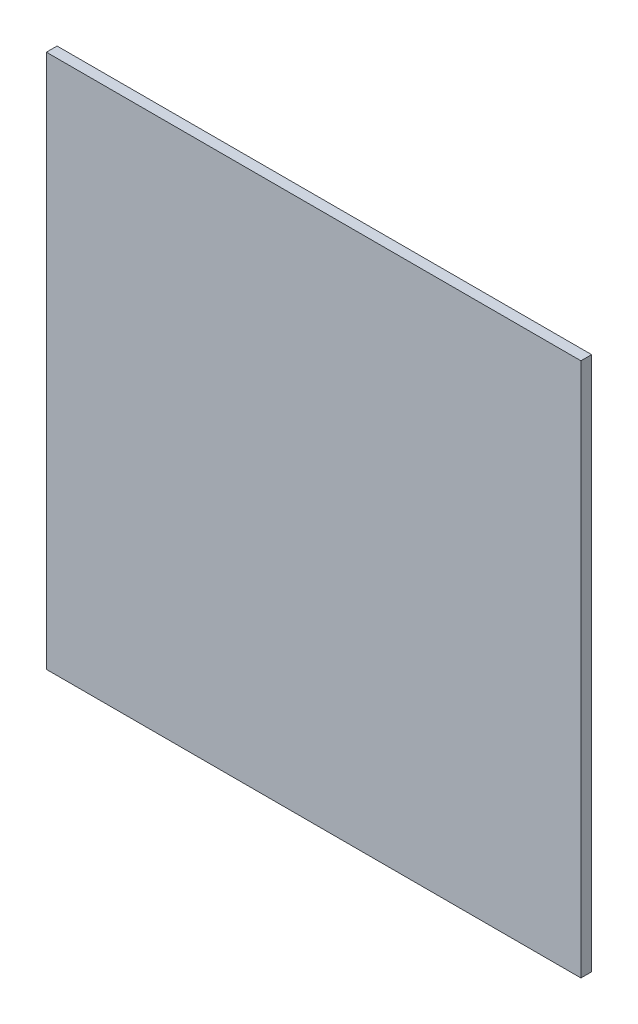
ISO-10303-21;
HEADER;
FILE_DESCRIPTION(('STEP AP214'),'2;1');
FILE_NAME('part.step','',(''),(''),'','','');
FILE_SCHEMA(('AUTOMOTIVE_DESIGN { 1 0 10303 214 1 1 1 1 }'));
ENDSEC;
DATA;
#1=APPLICATION_CONTEXT('core data for automotive mechanical design processes');
#2=APPLICATION_PROTOCOL_DEFINITION('international standard','automotive_design',2000,#1);
#3=PRODUCT_CONTEXT('',#1,'mechanical');
#4=PRODUCT('Part','Part','',(#3));
#5=PRODUCT_RELATED_PRODUCT_CATEGORY('part','',(#4));
#6=PRODUCT_DEFINITION_FORMATION('','',#4);
#7=PRODUCT_DEFINITION_CONTEXT('part definition',#1,'design');
#8=PRODUCT_DEFINITION('design','',#6,#7);
#9=PRODUCT_DEFINITION_SHAPE('','',#8);
#10=(LENGTH_UNIT() NAMED_UNIT(*) SI_UNIT(.MILLI.,.METRE.));
#11=(NAMED_UNIT(*) PLANE_ANGLE_UNIT() SI_UNIT($,.RADIAN.));
#12=(NAMED_UNIT(*) SI_UNIT($,.STERADIAN.) SOLID_ANGLE_UNIT());
#13=UNCERTAINTY_MEASURE_WITH_UNIT(LENGTH_MEASURE(1.E-05),#10,'distance_accuracy_value','');
#14=(GEOMETRIC_REPRESENTATION_CONTEXT(3) GLOBAL_UNCERTAINTY_ASSIGNED_CONTEXT((#13)) GLOBAL_UNIT_ASSIGNED_CONTEXT((#10,
#11,#12)) REPRESENTATION_CONTEXT('',''));
#15=CARTESIAN_POINT('',(0.,0.,0.));
#16=DIRECTION('',(0.,0.,1.));
#17=DIRECTION('',(1.,0.,0.));
#18=AXIS2_PLACEMENT_3D('',#15,#16,#17);
#19=CARTESIAN_POINT('',(0.,0.,2.));
#20=DIRECTION('',(1.,0.,0.));
#21=DIRECTION('',(0.,0.,-1.));
#22=AXIS2_PLACEMENT_3D('',#19,#20,#21);
#23=PLANE('',#22);
#24=DIRECTION('',(0.,-1.,0.));
#25=VECTOR('',#24,1.);
#26=CARTESIAN_POINT('',(0.,0.,0.));
#27=LINE('',#26,#25);
#28=CARTESIAN_POINT('',(0.,100.,0.));
#29=VERTEX_POINT('',#28);
#30=CARTESIAN_POINT('',(0.,0.,0.));
#31=VERTEX_POINT('',#30);
#32=EDGE_CURVE('E96',#29,#31,#27,.T.);
#33=ORIENTED_EDGE('',*,*,#32,.T.);
#34=DIRECTION('',(0.,0.,-1.));
#35=VECTOR('',#34,1.);
#36=CARTESIAN_POINT('',(0.,0.,2.));
#37=LINE('',#36,#35);
#38=CARTESIAN_POINT('',(0.,0.,2.));
#39=VERTEX_POINT('',#38);
#40=EDGE_CURVE('E11',#39,#31,#37,.T.);
#41=ORIENTED_EDGE('',*,*,#40,.F.);
#42=DIRECTION('',(0.,-1.,0.));
#43=VECTOR('',#42,1.);
#44=CARTESIAN_POINT('',(0.,0.,2.));
#45=LINE('',#44,#43);
#46=CARTESIAN_POINT('',(0.,100.,2.));
#47=VERTEX_POINT('',#46);
#48=EDGE_CURVE('E84',#47,#39,#45,.T.);
#49=ORIENTED_EDGE('',*,*,#48,.F.);
#50=DIRECTION('',(0.,0.,-1.));
#51=VECTOR('',#50,1.);
#52=CARTESIAN_POINT('',(0.,100.,2.));
#53=LINE('',#52,#51);
#54=EDGE_CURVE('E92',#47,#29,#53,.T.);
#55=ORIENTED_EDGE('',*,*,#54,.T.);
#56=EDGE_LOOP('',(#33,#41,#49,#55));
#57=FACE_BOUND('',#56,.T.);
#58=ADVANCED_FACE('F33',(#57),#23,.F.);
#59=CARTESIAN_POINT('',(0.,0.,2.));
#60=DIRECTION('',(0.,1.,0.));
#61=DIRECTION('',(0.,0.,1.));
#62=AXIS2_PLACEMENT_3D('',#59,#60,#61);
#63=PLANE('',#62);
#64=DIRECTION('',(1.,0.,0.));
#65=VECTOR('',#64,1.);
#66=CARTESIAN_POINT('',(0.,0.,0.));
#67=LINE('',#66,#65);
#68=CARTESIAN_POINT('',(100.,0.,0.));
#69=VERTEX_POINT('',#68);
#70=EDGE_CURVE('E88',#31,#69,#67,.T.);
#71=ORIENTED_EDGE('',*,*,#70,.T.);
#72=DIRECTION('',(0.,0.,-1.));
#73=VECTOR('',#72,1.);
#74=CARTESIAN_POINT('',(100.,0.,2.));
#75=LINE('',#74,#73);
#76=CARTESIAN_POINT('',(100.,0.,2.));
#77=VERTEX_POINT('',#76);
#78=EDGE_CURVE('E41',#77,#69,#75,.T.);
#79=ORIENTED_EDGE('',*,*,#78,.F.);
#80=DIRECTION('',(1.,0.,0.));
#81=VECTOR('',#80,1.);
#82=CARTESIAN_POINT('',(0.,0.,2.));
#83=LINE('',#82,#81);
#84=EDGE_CURVE('E79',#39,#77,#83,.T.);
#85=ORIENTED_EDGE('',*,*,#84,.F.);
#86=ORIENTED_EDGE('',*,*,#40,.T.);
#87=EDGE_LOOP('',(#71,#79,#85,#86));
#88=FACE_BOUND('',#87,.T.);
#89=ADVANCED_FACE('F87',(#88),#63,.F.);
#90=CARTESIAN_POINT('',(100.,0.,2.));
#91=DIRECTION('',(-1.,0.,0.));
#92=DIRECTION('',(0.,0.,1.));
#93=AXIS2_PLACEMENT_3D('',#90,#91,#92);
#94=PLANE('',#93);
#95=DIRECTION('',(0.,1.,0.));
#96=VECTOR('',#95,1.);
#97=CARTESIAN_POINT('',(100.,0.,0.));
#98=LINE('',#97,#96);
#99=CARTESIAN_POINT('',(100.,100.,0.));
#100=VERTEX_POINT('',#99);
#101=EDGE_CURVE('E66',#69,#100,#98,.T.);
#102=ORIENTED_EDGE('',*,*,#101,.T.);
#103=DIRECTION('',(0.,0.,-1.));
#104=VECTOR('',#103,1.);
#105=CARTESIAN_POINT('',(100.,100.,2.));
#106=LINE('',#105,#104);
#107=CARTESIAN_POINT('',(100.,100.,2.));
#108=VERTEX_POINT('',#107);
#109=EDGE_CURVE('E89',#108,#100,#106,.T.);
#110=ORIENTED_EDGE('',*,*,#109,.F.);
#111=DIRECTION('',(0.,1.,0.));
#112=VECTOR('',#111,1.);
#113=CARTESIAN_POINT('',(100.,0.,2.));
#114=LINE('',#113,#112);
#115=EDGE_CURVE('E82',#77,#108,#114,.T.);
#116=ORIENTED_EDGE('',*,*,#115,.F.);
#117=ORIENTED_EDGE('',*,*,#78,.T.);
#118=EDGE_LOOP('',(#102,#110,#116,#117));
#119=FACE_BOUND('',#118,.T.);
#120=ADVANCED_FACE('F90',(#119),#94,.F.);
#121=CARTESIAN_POINT('',(0.,100.,2.));
#122=DIRECTION('',(0.,-1.,0.));
#123=DIRECTION('',(0.,0.,-1.));
#124=AXIS2_PLACEMENT_3D('',#121,#122,#123);
#125=PLANE('',#124);
#126=DIRECTION('',(-1.,0.,0.));
#127=VECTOR('',#126,1.);
#128=CARTESIAN_POINT('',(0.,100.,0.));
#129=LINE('',#128,#127);
#130=EDGE_CURVE('E72',#100,#29,#129,.T.);
#131=ORIENTED_EDGE('',*,*,#130,.T.);
#132=ORIENTED_EDGE('',*,*,#54,.F.);
#133=DIRECTION('',(-1.,0.,0.));
#134=VECTOR('',#133,1.);
#135=CARTESIAN_POINT('',(0.,100.,2.));
#136=LINE('',#135,#134);
#137=EDGE_CURVE('E49',#108,#47,#136,.T.);
#138=ORIENTED_EDGE('',*,*,#137,.F.);
#139=ORIENTED_EDGE('',*,*,#109,.T.);
#140=EDGE_LOOP('',(#131,#132,#138,#139));
#141=FACE_BOUND('',#140,.T.);
#142=ADVANCED_FACE('F103',(#141),#125,.F.);
#143=CARTESIAN_POINT('',(0.,0.,2.));
#144=DIRECTION('',(0.,0.,-1.));
#145=DIRECTION('',(-1.,0.,0.));
#146=AXIS2_PLACEMENT_3D('',#143,#144,#145);
#147=PLANE('',#146);
#148=ORIENTED_EDGE('',*,*,#48,.T.);
#149=ORIENTED_EDGE('',*,*,#84,.T.);
#150=ORIENTED_EDGE('',*,*,#115,.T.);
#151=ORIENTED_EDGE('',*,*,#137,.T.);
#152=EDGE_LOOP('',(#148,#149,#150,#151));
#153=FACE_BOUND('',#152,.T.);
#154=ADVANCED_FACE('F80',(#153),#147,.F.);
#155=CARTESIAN_POINT('',(0.,0.,0.));
#156=DIRECTION('',(0.,0.,-1.));
#157=DIRECTION('',(-1.,0.,0.));
#158=AXIS2_PLACEMENT_3D('',#155,#156,#157);
#159=PLANE('',#158);
#160=ORIENTED_EDGE('',*,*,#32,.F.);
#161=ORIENTED_EDGE('',*,*,#130,.F.);
#162=ORIENTED_EDGE('',*,*,#101,.F.);
#163=ORIENTED_EDGE('',*,*,#70,.F.);
#164=EDGE_LOOP('',(#160,#161,#162,#163));
#165=FACE_BOUND('',#164,.T.);
#166=ADVANCED_FACE('F106',(#165),#159,.T.);
#167=CLOSED_SHELL('',(#58,#89,#120,#142,#154,#166));
#168=MANIFOLD_SOLID_BREP('B2',#167);
#169=ADVANCED_BREP_SHAPE_REPRESENTATION('',(#18,#168),#14);
#170=SHAPE_DEFINITION_REPRESENTATION(#9,#169);
ENDSEC;
END-ISO-10303-21;
